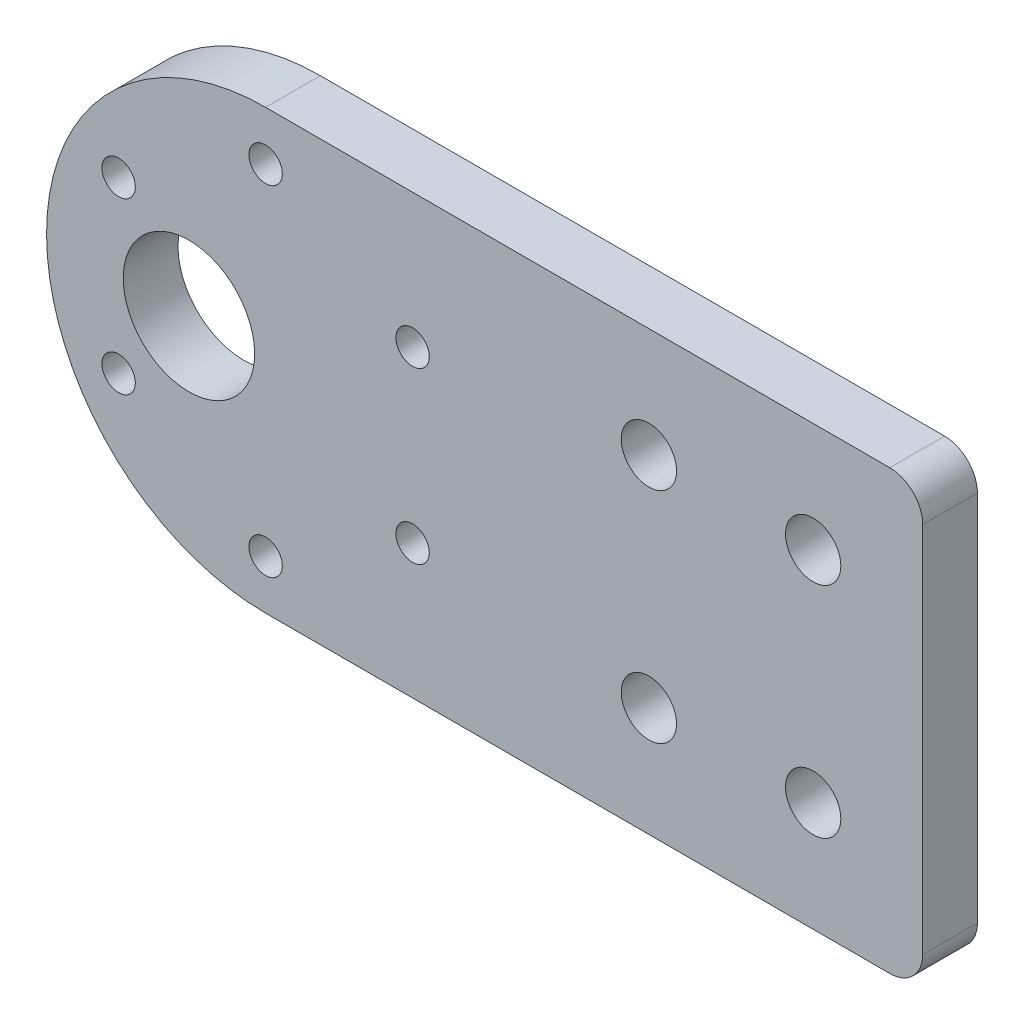
ISO-10303-21;
HEADER;
FILE_DESCRIPTION(('STEP AP214'),'2;1');
FILE_NAME('part.step','',(''),(''),'','','');
FILE_SCHEMA(('AUTOMOTIVE_DESIGN { 1 0 10303 214 1 1 1 1 }'));
ENDSEC;
DATA;
#1=APPLICATION_CONTEXT('core data for automotive mechanical design processes');
#2=APPLICATION_PROTOCOL_DEFINITION('international standard','automotive_design',2000,#1);
#3=PRODUCT_CONTEXT('',#1,'mechanical');
#4=PRODUCT('Part','Part','',(#3));
#5=PRODUCT_RELATED_PRODUCT_CATEGORY('part','',(#4));
#6=PRODUCT_DEFINITION_FORMATION('','',#4);
#7=PRODUCT_DEFINITION_CONTEXT('part definition',#1,'design');
#8=PRODUCT_DEFINITION('design','',#6,#7);
#9=PRODUCT_DEFINITION_SHAPE('','',#8);
#10=(LENGTH_UNIT() NAMED_UNIT(*) SI_UNIT(.MILLI.,.METRE.));
#11=(NAMED_UNIT(*) PLANE_ANGLE_UNIT() SI_UNIT($,.RADIAN.));
#12=(NAMED_UNIT(*) SI_UNIT($,.STERADIAN.) SOLID_ANGLE_UNIT());
#13=UNCERTAINTY_MEASURE_WITH_UNIT(LENGTH_MEASURE(1.E-05),#10,'distance_accuracy_value','');
#14=(GEOMETRIC_REPRESENTATION_CONTEXT(3) GLOBAL_UNCERTAINTY_ASSIGNED_CONTEXT((#13)) GLOBAL_UNIT_ASSIGNED_CONTEXT((#10,
#11,#12)) REPRESENTATION_CONTEXT('',''));
#15=CARTESIAN_POINT('',(0.,0.,0.));
#16=DIRECTION('',(0.,0.,1.));
#17=DIRECTION('',(1.,0.,0.));
#18=AXIS2_PLACEMENT_3D('',#15,#16,#17);
#19=CARTESIAN_POINT('',(0.,0.,5.));
#20=DIRECTION('',(0.,0.,-1.));
#21=DIRECTION('',(-1.,0.,0.));
#22=AXIS2_PLACEMENT_3D('',#19,#20,#21);
#23=PLANE('',#22);
#24=CARTESIAN_POINT('',(20.,35.5,5.));
#25=DIRECTION('',(0.,0.,1.));
#26=DIRECTION('',(1.,0.,0.));
#27=AXIS2_PLACEMENT_3D('',#24,#25,#26);
#28=CIRCLE('',#27,1.525);
#29=CARTESIAN_POINT('',(21.525,35.5,5.));
#30=VERTEX_POINT('',#29);
#31=EDGE_CURVE('E323',#30,#30,#28,.T.);
#32=ORIENTED_EDGE('',*,*,#31,.F.);
#33=EDGE_LOOP('',(#32));
#34=FACE_BOUND('',#33,.T.);
#35=CARTESIAN_POINT('',(6.57660624134164,27.7499999999996,5.));
#36=DIRECTION('',(0.,0.,1.));
#37=DIRECTION('',(1.,0.,0.));
#38=AXIS2_PLACEMENT_3D('',#35,#36,#37);
#39=CIRCLE('',#38,1.525);
#40=CARTESIAN_POINT('',(8.10160624134164,27.7499999999996,5.));
#41=VERTEX_POINT('',#40);
#42=EDGE_CURVE('E339',#41,#41,#39,.T.);
#43=ORIENTED_EDGE('',*,*,#42,.F.);
#44=EDGE_LOOP('',(#43));
#45=FACE_BOUND('',#44,.T.);
#46=CARTESIAN_POINT('',(6.57660624134222,12.2499999999994,5.));
#47=DIRECTION('',(0.,0.,1.));
#48=DIRECTION('',(1.,0.,0.));
#49=AXIS2_PLACEMENT_3D('',#46,#47,#48);
#50=CIRCLE('',#49,1.525);
#51=CARTESIAN_POINT('',(8.10160624134222,12.2499999999994,5.));
#52=VERTEX_POINT('',#51);
#53=EDGE_CURVE('E332',#52,#52,#50,.T.);
#54=ORIENTED_EDGE('',*,*,#53,.F.);
#55=EDGE_LOOP('',(#54));
#56=FACE_BOUND('',#55,.T.);
#57=CARTESIAN_POINT('',(20.0000000000013,4.5,5.));
#58=DIRECTION('',(0.,0.,1.));
#59=DIRECTION('',(1.,0.,0.));
#60=AXIS2_PLACEMENT_3D('',#57,#58,#59);
#61=CIRCLE('',#60,1.525);
#62=CARTESIAN_POINT('',(21.5250000000013,4.5,5.));
#63=VERTEX_POINT('',#62);
#64=EDGE_CURVE('E362',#63,#63,#61,.T.);
#65=ORIENTED_EDGE('',*,*,#64,.F.);
#66=EDGE_LOOP('',(#65));
#67=FACE_BOUND('',#66,.T.);
#68=CARTESIAN_POINT('',(33.4233937586598,12.2500000000006,5.));
#69=DIRECTION('',(0.,0.,1.));
#70=DIRECTION('',(1.,0.,0.));
#71=AXIS2_PLACEMENT_3D('',#68,#69,#70);
#72=CIRCLE('',#71,1.525);
#73=CARTESIAN_POINT('',(34.9483937586598,12.2500000000006,5.));
#74=VERTEX_POINT('',#73);
#75=EDGE_CURVE('E356',#74,#74,#72,.T.);
#76=ORIENTED_EDGE('',*,*,#75,.F.);
#77=EDGE_LOOP('',(#76));
#78=FACE_BOUND('',#77,.T.);
#79=CARTESIAN_POINT('',(33.4233937586592,27.7500000000006,5.));
#80=DIRECTION('',(0.,0.,1.));
#81=DIRECTION('',(1.,0.,0.));
#82=AXIS2_PLACEMENT_3D('',#79,#80,#81);
#83=CIRCLE('',#82,1.525);
#84=CARTESIAN_POINT('',(34.9483937586592,27.7500000000006,5.));
#85=VERTEX_POINT('',#84);
#86=EDGE_CURVE('E350',#85,#85,#83,.T.);
#87=ORIENTED_EDGE('',*,*,#86,.F.);
#88=EDGE_LOOP('',(#87));
#89=FACE_BOUND('',#88,.T.);
#90=CARTESIAN_POINT('',(13.,20.,5.));
#91=DIRECTION('',(0.,0.,1.));
#92=DIRECTION('',(1.,0.,0.));
#93=AXIS2_PLACEMENT_3D('',#90,#91,#92);
#94=CIRCLE('',#93,6.);
#95=CARTESIAN_POINT('',(19.,20.,5.));
#96=VERTEX_POINT('',#95);
#97=EDGE_CURVE('E329',#96,#96,#94,.T.);
#98=ORIENTED_EDGE('',*,*,#97,.F.);
#99=EDGE_LOOP('',(#98));
#100=FACE_BOUND('',#99,.T.);
#101=CARTESIAN_POINT('',(70.,30.,5.));
#102=DIRECTION('',(0.,0.,1.));
#103=DIRECTION('',(1.,0.,0.));
#104=AXIS2_PLACEMENT_3D('',#101,#102,#103);
#105=CIRCLE('',#104,2.52499999999999);
#106=CARTESIAN_POINT('',(72.525,30.,5.));
#107=VERTEX_POINT('',#106);
#108=EDGE_CURVE('E370',#107,#107,#105,.T.);
#109=ORIENTED_EDGE('',*,*,#108,.F.);
#110=EDGE_LOOP('',(#109));
#111=FACE_BOUND('',#110,.T.);
#112=CARTESIAN_POINT('',(55.,10.,5.));
#113=DIRECTION('',(0.,0.,1.));
#114=DIRECTION('',(1.,0.,0.));
#115=AXIS2_PLACEMENT_3D('',#112,#113,#114);
#116=CIRCLE('',#115,2.525);
#117=CARTESIAN_POINT('',(57.525,10.,5.));
#118=VERTEX_POINT('',#117);
#119=EDGE_CURVE('E376',#118,#118,#116,.T.);
#120=ORIENTED_EDGE('',*,*,#119,.F.);
#121=EDGE_LOOP('',(#120));
#122=FACE_BOUND('',#121,.T.);
#123=CARTESIAN_POINT('',(70.,10.,5.));
#124=DIRECTION('',(0.,0.,1.));
#125=DIRECTION('',(1.,0.,0.));
#126=AXIS2_PLACEMENT_3D('',#123,#124,#125);
#127=CIRCLE('',#126,2.52499999999999);
#128=CARTESIAN_POINT('',(72.525,10.,5.));
#129=VERTEX_POINT('',#128);
#130=EDGE_CURVE('E327',#129,#129,#127,.T.);
#131=ORIENTED_EDGE('',*,*,#130,.F.);
#132=EDGE_LOOP('',(#131));
#133=FACE_BOUND('',#132,.T.);
#134=CARTESIAN_POINT('',(55.,30.,5.));
#135=DIRECTION('',(0.,0.,1.));
#136=DIRECTION('',(1.,0.,0.));
#137=AXIS2_PLACEMENT_3D('',#134,#135,#136);
#138=CIRCLE('',#137,2.525);
#139=CARTESIAN_POINT('',(57.525,30.,5.));
#140=VERTEX_POINT('',#139);
#141=EDGE_CURVE('E128',#140,#140,#138,.T.);
#142=ORIENTED_EDGE('',*,*,#141,.F.);
#143=EDGE_LOOP('',(#142));
#144=FACE_BOUND('',#143,.T.);
#145=DIRECTION('',(1.,0.,0.));
#146=VECTOR('',#145,1.);
#147=CARTESIAN_POINT('',(80.,0.,5.));
#148=LINE('',#147,#146);
#149=CARTESIAN_POINT('',(20.,0.,5.));
#150=VERTEX_POINT('',#149);
#151=CARTESIAN_POINT('',(77.,0.,5.));
#152=VERTEX_POINT('',#151);
#153=EDGE_CURVE('E113',#150,#152,#148,.T.);
#154=ORIENTED_EDGE('',*,*,#153,.T.);
#155=CARTESIAN_POINT('',(77.,3.,5.));
#156=DIRECTION('',(0.,0.,-1.));
#157=DIRECTION('',(-1.,0.,0.));
#158=AXIS2_PLACEMENT_3D('',#155,#156,#157);
#159=CIRCLE('',#158,3.);
#160=CARTESIAN_POINT('',(80.,3.,5.));
#161=VERTEX_POINT('',#160);
#162=EDGE_CURVE('E58',#152,#161,#159,.F.);
#163=ORIENTED_EDGE('',*,*,#162,.T.);
#164=DIRECTION('',(0.,1.,0.));
#165=VECTOR('',#164,1.);
#166=CARTESIAN_POINT('',(80.,40.,5.));
#167=LINE('',#166,#165);
#168=CARTESIAN_POINT('',(80.,37.,5.));
#169=VERTEX_POINT('',#168);
#170=EDGE_CURVE('E139',#161,#169,#167,.T.);
#171=ORIENTED_EDGE('',*,*,#170,.T.);
#172=CARTESIAN_POINT('',(77.,37.,5.));
#173=DIRECTION('',(0.,0.,-1.));
#174=DIRECTION('',(-1.,0.,0.));
#175=AXIS2_PLACEMENT_3D('',#172,#173,#174);
#176=CIRCLE('',#175,3.);
#177=CARTESIAN_POINT('',(77.,40.,5.));
#178=VERTEX_POINT('',#177);
#179=EDGE_CURVE('E65',#169,#178,#176,.F.);
#180=ORIENTED_EDGE('',*,*,#179,.T.);
#181=DIRECTION('',(-1.,0.,0.));
#182=VECTOR('',#181,1.);
#183=CARTESIAN_POINT('',(0.,40.,5.));
#184=LINE('',#183,#182);
#185=CARTESIAN_POINT('',(20.,40.,5.));
#186=VERTEX_POINT('',#185);
#187=EDGE_CURVE('E141',#178,#186,#184,.T.);
#188=ORIENTED_EDGE('',*,*,#187,.T.);
#189=CARTESIAN_POINT('',(20.,20.,5.));
#190=DIRECTION('',(0.,0.,1.));
#191=DIRECTION('',(1.,0.,0.));
#192=AXIS2_PLACEMENT_3D('',#189,#190,#191);
#193=CIRCLE('',#192,20.);
#194=EDGE_CURVE('E123',#186,#150,#193,.T.);
#195=ORIENTED_EDGE('',*,*,#194,.T.);
#196=EDGE_LOOP('',(#154,#163,#171,#180,#188,#195));
#197=FACE_BOUND('',#196,.T.);
#198=ADVANCED_FACE('F50',(#34,#45,#56,#67,#78,#89,#100,#111,#122,#133,#144,#197),#23,.F.);
#199=CARTESIAN_POINT('',(0.,0.,0.));
#200=DIRECTION('',(0.,0.,-1.));
#201=DIRECTION('',(-1.,0.,0.));
#202=AXIS2_PLACEMENT_3D('',#199,#200,#201);
#203=PLANE('',#202);
#204=CARTESIAN_POINT('',(20.,35.5,0.));
#205=DIRECTION('',(0.,0.,-1.));
#206=DIRECTION('',(-1.,0.,0.));
#207=AXIS2_PLACEMENT_3D('',#204,#205,#206);
#208=CIRCLE('',#207,1.525);
#209=CARTESIAN_POINT('',(18.475,35.5,0.));
#210=VERTEX_POINT('',#209);
#211=EDGE_CURVE('E321',#210,#210,#208,.F.);
#212=ORIENTED_EDGE('',*,*,#211,.T.);
#213=EDGE_LOOP('',(#212));
#214=FACE_BOUND('',#213,.T.);
#215=CARTESIAN_POINT('',(6.57660624134164,27.7499999999996,0.));
#216=DIRECTION('',(0.,0.,-1.));
#217=DIRECTION('',(-1.,0.,0.));
#218=AXIS2_PLACEMENT_3D('',#215,#216,#217);
#219=CIRCLE('',#218,1.525);
#220=CARTESIAN_POINT('',(5.05160624134164,27.7499999999996,0.));
#221=VERTEX_POINT('',#220);
#222=EDGE_CURVE('E342',#221,#221,#219,.F.);
#223=ORIENTED_EDGE('',*,*,#222,.T.);
#224=EDGE_LOOP('',(#223));
#225=FACE_BOUND('',#224,.T.);
#226=CARTESIAN_POINT('',(6.57660624134222,12.2499999999994,0.));
#227=DIRECTION('',(0.,0.,-1.));
#228=DIRECTION('',(-1.,0.,0.));
#229=AXIS2_PLACEMENT_3D('',#226,#227,#228);
#230=CIRCLE('',#229,1.525);
#231=CARTESIAN_POINT('',(5.05160624134222,12.2499999999994,0.));
#232=VERTEX_POINT('',#231);
#233=EDGE_CURVE('E336',#232,#232,#230,.F.);
#234=ORIENTED_EDGE('',*,*,#233,.T.);
#235=EDGE_LOOP('',(#234));
#236=FACE_BOUND('',#235,.T.);
#237=CARTESIAN_POINT('',(20.0000000000013,4.5,0.));
#238=DIRECTION('',(0.,0.,-1.));
#239=DIRECTION('',(-1.,0.,0.));
#240=AXIS2_PLACEMENT_3D('',#237,#238,#239);
#241=CIRCLE('',#240,1.525);
#242=CARTESIAN_POINT('',(18.4750000000013,4.5,0.));
#243=VERTEX_POINT('',#242);
#244=EDGE_CURVE('E335',#243,#243,#241,.F.);
#245=ORIENTED_EDGE('',*,*,#244,.T.);
#246=EDGE_LOOP('',(#245));
#247=FACE_BOUND('',#246,.T.);
#248=CARTESIAN_POINT('',(33.4233937586598,12.2500000000006,0.));
#249=DIRECTION('',(0.,0.,-1.));
#250=DIRECTION('',(-1.,0.,0.));
#251=AXIS2_PLACEMENT_3D('',#248,#249,#250);
#252=CIRCLE('',#251,1.525);
#253=CARTESIAN_POINT('',(31.8983937586598,12.2500000000006,0.));
#254=VERTEX_POINT('',#253);
#255=EDGE_CURVE('E359',#254,#254,#252,.F.);
#256=ORIENTED_EDGE('',*,*,#255,.T.);
#257=EDGE_LOOP('',(#256));
#258=FACE_BOUND('',#257,.T.);
#259=CARTESIAN_POINT('',(33.4233937586592,27.7500000000006,0.));
#260=DIRECTION('',(0.,0.,-1.));
#261=DIRECTION('',(-1.,0.,0.));
#262=AXIS2_PLACEMENT_3D('',#259,#260,#261);
#263=CIRCLE('',#262,1.525);
#264=CARTESIAN_POINT('',(31.8983937586592,27.7500000000006,0.));
#265=VERTEX_POINT('',#264);
#266=EDGE_CURVE('E353',#265,#265,#263,.F.);
#267=ORIENTED_EDGE('',*,*,#266,.T.);
#268=EDGE_LOOP('',(#267));
#269=FACE_BOUND('',#268,.T.);
#270=CARTESIAN_POINT('',(13.,20.,0.));
#271=DIRECTION('',(0.,0.,-1.));
#272=DIRECTION('',(-1.,0.,0.));
#273=AXIS2_PLACEMENT_3D('',#270,#271,#272);
#274=CIRCLE('',#273,6.);
#275=CARTESIAN_POINT('',(7.00000000000002,20.,0.));
#276=VERTEX_POINT('',#275);
#277=EDGE_CURVE('E347',#276,#276,#274,.F.);
#278=ORIENTED_EDGE('',*,*,#277,.T.);
#279=EDGE_LOOP('',(#278));
#280=FACE_BOUND('',#279,.T.);
#281=CARTESIAN_POINT('',(70.,30.,0.));
#282=DIRECTION('',(0.,0.,-1.));
#283=DIRECTION('',(-1.,0.,0.));
#284=AXIS2_PLACEMENT_3D('',#281,#282,#283);
#285=CIRCLE('',#284,2.52499999999999);
#286=CARTESIAN_POINT('',(67.475,30.,0.));
#287=VERTEX_POINT('',#286);
#288=EDGE_CURVE('E373',#287,#287,#285,.F.);
#289=ORIENTED_EDGE('',*,*,#288,.T.);
#290=EDGE_LOOP('',(#289));
#291=FACE_BOUND('',#290,.T.);
#292=CARTESIAN_POINT('',(55.,10.,0.));
#293=DIRECTION('',(0.,0.,-1.));
#294=DIRECTION('',(-1.,0.,0.));
#295=AXIS2_PLACEMENT_3D('',#292,#293,#294);
#296=CIRCLE('',#295,2.525);
#297=CARTESIAN_POINT('',(52.475,10.,0.));
#298=VERTEX_POINT('',#297);
#299=EDGE_CURVE('E368',#298,#298,#296,.F.);
#300=ORIENTED_EDGE('',*,*,#299,.T.);
#301=EDGE_LOOP('',(#300));
#302=FACE_BOUND('',#301,.T.);
#303=CARTESIAN_POINT('',(70.,10.,0.));
#304=DIRECTION('',(0.,0.,-1.));
#305=DIRECTION('',(-1.,0.,0.));
#306=AXIS2_PLACEMENT_3D('',#303,#304,#305);
#307=CIRCLE('',#306,2.52499999999999);
#308=CARTESIAN_POINT('',(67.475,10.,0.));
#309=VERTEX_POINT('',#308);
#310=EDGE_CURVE('E324',#309,#309,#307,.F.);
#311=ORIENTED_EDGE('',*,*,#310,.T.);
#312=EDGE_LOOP('',(#311));
#313=FACE_BOUND('',#312,.T.);
#314=CARTESIAN_POINT('',(55.,30.,0.));
#315=DIRECTION('',(0.,0.,-1.));
#316=DIRECTION('',(-1.,0.,0.));
#317=AXIS2_PLACEMENT_3D('',#314,#315,#316);
#318=CIRCLE('',#317,2.525);
#319=CARTESIAN_POINT('',(52.475,30.,0.));
#320=VERTEX_POINT('',#319);
#321=EDGE_CURVE('E131',#320,#320,#318,.F.);
#322=ORIENTED_EDGE('',*,*,#321,.T.);
#323=EDGE_LOOP('',(#322));
#324=FACE_BOUND('',#323,.T.);
#325=DIRECTION('',(0.,1.,0.));
#326=VECTOR('',#325,1.);
#327=CARTESIAN_POINT('',(80.,40.,0.));
#328=LINE('',#327,#326);
#329=CARTESIAN_POINT('',(80.,3.,0.));
#330=VERTEX_POINT('',#329);
#331=CARTESIAN_POINT('',(80.,37.,0.));
#332=VERTEX_POINT('',#331);
#333=EDGE_CURVE('E114',#330,#332,#328,.T.);
#334=ORIENTED_EDGE('',*,*,#333,.F.);
#335=CARTESIAN_POINT('',(77.,3.,0.));
#336=DIRECTION('',(0.,0.,-1.));
#337=DIRECTION('',(-1.,0.,0.));
#338=AXIS2_PLACEMENT_3D('',#335,#336,#337);
#339=CIRCLE('',#338,3.);
#340=CARTESIAN_POINT('',(77.,0.,0.));
#341=VERTEX_POINT('',#340);
#342=EDGE_CURVE('E153',#330,#341,#339,.T.);
#343=ORIENTED_EDGE('',*,*,#342,.T.);
#344=DIRECTION('',(1.,0.,0.));
#345=VECTOR('',#344,1.);
#346=CARTESIAN_POINT('',(80.,0.,0.));
#347=LINE('',#346,#345);
#348=CARTESIAN_POINT('',(20.,0.,0.));
#349=VERTEX_POINT('',#348);
#350=EDGE_CURVE('E120',#349,#341,#347,.T.);
#351=ORIENTED_EDGE('',*,*,#350,.F.);
#352=CARTESIAN_POINT('',(20.,20.,0.));
#353=DIRECTION('',(0.,0.,-1.));
#354=DIRECTION('',(-1.,0.,0.));
#355=AXIS2_PLACEMENT_3D('',#352,#353,#354);
#356=CIRCLE('',#355,20.);
#357=CARTESIAN_POINT('',(20.,40.,0.));
#358=VERTEX_POINT('',#357);
#359=EDGE_CURVE('E117',#358,#349,#356,.F.);
#360=ORIENTED_EDGE('',*,*,#359,.F.);
#361=DIRECTION('',(-1.,0.,0.));
#362=VECTOR('',#361,1.);
#363=CARTESIAN_POINT('',(0.,40.,0.));
#364=LINE('',#363,#362);
#365=CARTESIAN_POINT('',(77.,40.,0.));
#366=VERTEX_POINT('',#365);
#367=EDGE_CURVE('E106',#366,#358,#364,.T.);
#368=ORIENTED_EDGE('',*,*,#367,.F.);
#369=CARTESIAN_POINT('',(77.,37.,0.));
#370=DIRECTION('',(0.,0.,-1.));
#371=DIRECTION('',(-1.,0.,0.));
#372=AXIS2_PLACEMENT_3D('',#369,#370,#371);
#373=CIRCLE('',#372,3.);
#374=EDGE_CURVE('E151',#366,#332,#373,.T.);
#375=ORIENTED_EDGE('',*,*,#374,.T.);
#376=EDGE_LOOP('',(#334,#343,#351,#360,#368,#375));
#377=FACE_BOUND('',#376,.T.);
#378=ADVANCED_FACE('F119',(#214,#225,#236,#247,#258,#269,#280,#291,#302,#313,#324,#377),#203,.T.);
#379=CARTESIAN_POINT('',(80.,0.,5.));
#380=DIRECTION('',(0.,1.,0.));
#381=DIRECTION('',(0.,0.,1.));
#382=AXIS2_PLACEMENT_3D('',#379,#380,#381);
#383=PLANE('',#382);
#384=ORIENTED_EDGE('',*,*,#350,.T.);
#385=DIRECTION('',(0.,0.,-1.));
#386=VECTOR('',#385,1.);
#387=CARTESIAN_POINT('',(77.,0.,5.));
#388=LINE('',#387,#386);
#389=EDGE_CURVE('E73',#341,#152,#388,.F.);
#390=ORIENTED_EDGE('',*,*,#389,.T.);
#391=ORIENTED_EDGE('',*,*,#153,.F.);
#392=DIRECTION('',(0.,0.,1.));
#393=VECTOR('',#392,1.);
#394=CARTESIAN_POINT('',(20.,0.,-0.000999999999973245));
#395=LINE('',#394,#393);
#396=EDGE_CURVE('E136',#349,#150,#395,.T.);
#397=ORIENTED_EDGE('',*,*,#396,.F.);
#398=EDGE_LOOP('',(#384,#390,#391,#397));
#399=FACE_BOUND('',#398,.T.);
#400=ADVANCED_FACE('F164',(#399),#383,.F.);
#401=CARTESIAN_POINT('',(80.,40.,5.));
#402=DIRECTION('',(-1.,0.,0.));
#403=DIRECTION('',(0.,0.,1.));
#404=AXIS2_PLACEMENT_3D('',#401,#402,#403);
#405=PLANE('',#404);
#406=ORIENTED_EDGE('',*,*,#170,.F.);
#407=DIRECTION('',(0.,0.,-1.));
#408=VECTOR('',#407,1.);
#409=CARTESIAN_POINT('',(80.,3.,5.));
#410=LINE('',#409,#408);
#411=EDGE_CURVE('E148',#161,#330,#410,.T.);
#412=ORIENTED_EDGE('',*,*,#411,.T.);
#413=ORIENTED_EDGE('',*,*,#333,.T.);
#414=DIRECTION('',(0.,0.,-1.));
#415=VECTOR('',#414,1.);
#416=CARTESIAN_POINT('',(80.,37.,5.));
#417=LINE('',#416,#415);
#418=EDGE_CURVE('E143',#332,#169,#417,.F.);
#419=ORIENTED_EDGE('',*,*,#418,.T.);
#420=EDGE_LOOP('',(#406,#412,#413,#419));
#421=FACE_BOUND('',#420,.T.);
#422=ADVANCED_FACE('F161',(#421),#405,.F.);
#423=CARTESIAN_POINT('',(0.,40.,5.));
#424=DIRECTION('',(0.,-1.,0.));
#425=DIRECTION('',(0.,0.,-1.));
#426=AXIS2_PLACEMENT_3D('',#423,#424,#425);
#427=PLANE('',#426);
#428=ORIENTED_EDGE('',*,*,#187,.F.);
#429=DIRECTION('',(0.,0.,-1.));
#430=VECTOR('',#429,1.);
#431=CARTESIAN_POINT('',(77.,40.,5.));
#432=LINE('',#431,#430);
#433=EDGE_CURVE('E12',#178,#366,#432,.T.);
#434=ORIENTED_EDGE('',*,*,#433,.T.);
#435=ORIENTED_EDGE('',*,*,#367,.T.);
#436=DIRECTION('',(0.,0.,1.));
#437=VECTOR('',#436,1.);
#438=CARTESIAN_POINT('',(20.,40.,-0.000999999999973245));
#439=LINE('',#438,#437);
#440=EDGE_CURVE('E110',#358,#186,#439,.T.);
#441=ORIENTED_EDGE('',*,*,#440,.T.);
#442=EDGE_LOOP('',(#428,#434,#435,#441));
#443=FACE_BOUND('',#442,.T.);
#444=ADVANCED_FACE('F108',(#443),#427,.F.);
#445=CARTESIAN_POINT('',(20.,20.,-0.000999999999973245));
#446=DIRECTION('',(0.,0.,1.));
#447=DIRECTION('',(1.,0.,0.));
#448=AXIS2_PLACEMENT_3D('',#445,#446,#447);
#449=CYLINDRICAL_SURFACE('',#448,20.);
#450=ORIENTED_EDGE('',*,*,#359,.T.);
#451=ORIENTED_EDGE('',*,*,#396,.T.);
#452=ORIENTED_EDGE('',*,*,#194,.F.);
#453=ORIENTED_EDGE('',*,*,#440,.F.);
#454=EDGE_LOOP('',(#450,#451,#452,#453));
#455=FACE_BOUND('',#454,.T.);
#456=ADVANCED_FACE('F126',(#455),#449,.T.);
#457=CARTESIAN_POINT('',(55.,30.,-0.000999999999973245));
#458=DIRECTION('',(0.,0.,1.));
#459=DIRECTION('',(1.,0.,0.));
#460=AXIS2_PLACEMENT_3D('',#457,#458,#459);
#461=CYLINDRICAL_SURFACE('',#460,2.525);
#462=ORIENTED_EDGE('',*,*,#321,.F.);
#463=EDGE_LOOP('',(#462));
#464=FACE_BOUND('',#463,.T.);
#465=ORIENTED_EDGE('',*,*,#141,.T.);
#466=EDGE_LOOP('',(#465));
#467=FACE_BOUND('',#466,.T.);
#468=ADVANCED_FACE('F212',(#464,#467),#461,.F.);
#469=CARTESIAN_POINT('',(70.,10.,-0.000999999999973245));
#470=DIRECTION('',(0.,0.,1.));
#471=DIRECTION('',(1.,0.,0.));
#472=AXIS2_PLACEMENT_3D('',#469,#470,#471);
#473=CYLINDRICAL_SURFACE('',#472,2.52499999999999);
#474=ORIENTED_EDGE('',*,*,#310,.F.);
#475=EDGE_LOOP('',(#474));
#476=FACE_BOUND('',#475,.T.);
#477=ORIENTED_EDGE('',*,*,#130,.T.);
#478=EDGE_LOOP('',(#477));
#479=FACE_BOUND('',#478,.T.);
#480=ADVANCED_FACE('F218',(#476,#479),#473,.F.);
#481=CARTESIAN_POINT('',(55.,10.,-0.000999999999973245));
#482=DIRECTION('',(0.,0.,1.));
#483=DIRECTION('',(1.,0.,0.));
#484=AXIS2_PLACEMENT_3D('',#481,#482,#483);
#485=CYLINDRICAL_SURFACE('',#484,2.525);
#486=ORIENTED_EDGE('',*,*,#299,.F.);
#487=EDGE_LOOP('',(#486));
#488=FACE_BOUND('',#487,.T.);
#489=ORIENTED_EDGE('',*,*,#119,.T.);
#490=EDGE_LOOP('',(#489));
#491=FACE_BOUND('',#490,.T.);
#492=ADVANCED_FACE('F225',(#488,#491),#485,.F.);
#493=CARTESIAN_POINT('',(70.,30.,-0.000999999999973245));
#494=DIRECTION('',(0.,0.,1.));
#495=DIRECTION('',(1.,0.,0.));
#496=AXIS2_PLACEMENT_3D('',#493,#494,#495);
#497=CYLINDRICAL_SURFACE('',#496,2.52499999999999);
#498=ORIENTED_EDGE('',*,*,#288,.F.);
#499=EDGE_LOOP('',(#498));
#500=FACE_BOUND('',#499,.T.);
#501=ORIENTED_EDGE('',*,*,#108,.T.);
#502=EDGE_LOOP('',(#501));
#503=FACE_BOUND('',#502,.T.);
#504=ADVANCED_FACE('F175',(#500,#503),#497,.F.);
#505=CARTESIAN_POINT('',(77.,3.,5.));
#506=DIRECTION('',(0.,0.,-1.));
#507=DIRECTION('',(-1.,0.,0.));
#508=AXIS2_PLACEMENT_3D('',#505,#506,#507);
#509=CYLINDRICAL_SURFACE('',#508,3.);
#510=ORIENTED_EDGE('',*,*,#162,.F.);
#511=ORIENTED_EDGE('',*,*,#389,.F.);
#512=ORIENTED_EDGE('',*,*,#342,.F.);
#513=ORIENTED_EDGE('',*,*,#411,.F.);
#514=EDGE_LOOP('',(#510,#511,#512,#513));
#515=FACE_BOUND('',#514,.T.);
#516=ADVANCED_FACE('F163',(#515),#509,.T.);
#517=CARTESIAN_POINT('',(77.,37.,5.));
#518=DIRECTION('',(0.,0.,-1.));
#519=DIRECTION('',(-1.,0.,0.));
#520=AXIS2_PLACEMENT_3D('',#517,#518,#519);
#521=CYLINDRICAL_SURFACE('',#520,3.);
#522=ORIENTED_EDGE('',*,*,#179,.F.);
#523=ORIENTED_EDGE('',*,*,#418,.F.);
#524=ORIENTED_EDGE('',*,*,#374,.F.);
#525=ORIENTED_EDGE('',*,*,#433,.F.);
#526=EDGE_LOOP('',(#522,#523,#524,#525));
#527=FACE_BOUND('',#526,.T.);
#528=ADVANCED_FACE('F52',(#527),#521,.T.);
#529=CARTESIAN_POINT('',(13.,20.,-0.000999999999973245));
#530=DIRECTION('',(0.,0.,1.));
#531=DIRECTION('',(1.,0.,0.));
#532=AXIS2_PLACEMENT_3D('',#529,#530,#531);
#533=CYLINDRICAL_SURFACE('',#532,6.);
#534=ORIENTED_EDGE('',*,*,#277,.F.);
#535=EDGE_LOOP('',(#534));
#536=FACE_BOUND('',#535,.T.);
#537=ORIENTED_EDGE('',*,*,#97,.T.);
#538=EDGE_LOOP('',(#537));
#539=FACE_BOUND('',#538,.T.);
#540=ADVANCED_FACE('F167',(#536,#539),#533,.F.);
#541=CARTESIAN_POINT('',(33.4233937586592,27.7500000000006,-0.000999999999973245));
#542=DIRECTION('',(0.,0.,1.));
#543=DIRECTION('',(1.,0.,0.));
#544=AXIS2_PLACEMENT_3D('',#541,#542,#543);
#545=CYLINDRICAL_SURFACE('',#544,1.525);
#546=ORIENTED_EDGE('',*,*,#266,.F.);
#547=EDGE_LOOP('',(#546));
#548=FACE_BOUND('',#547,.T.);
#549=ORIENTED_EDGE('',*,*,#86,.T.);
#550=EDGE_LOOP('',(#549));
#551=FACE_BOUND('',#550,.T.);
#552=ADVANCED_FACE('F172',(#548,#551),#545,.F.);
#553=CARTESIAN_POINT('',(33.4233937586598,12.2500000000006,-0.000999999999973245));
#554=DIRECTION('',(0.,0.,1.));
#555=DIRECTION('',(1.,0.,0.));
#556=AXIS2_PLACEMENT_3D('',#553,#554,#555);
#557=CYLINDRICAL_SURFACE('',#556,1.525);
#558=ORIENTED_EDGE('',*,*,#255,.F.);
#559=EDGE_LOOP('',(#558));
#560=FACE_BOUND('',#559,.T.);
#561=ORIENTED_EDGE('',*,*,#75,.T.);
#562=EDGE_LOOP('',(#561));
#563=FACE_BOUND('',#562,.T.);
#564=ADVANCED_FACE('F264',(#560,#563),#557,.F.);
#565=CARTESIAN_POINT('',(20.0000000000013,4.5,-0.000999999999973245));
#566=DIRECTION('',(0.,0.,1.));
#567=DIRECTION('',(1.,0.,0.));
#568=AXIS2_PLACEMENT_3D('',#565,#566,#567);
#569=CYLINDRICAL_SURFACE('',#568,1.525);
#570=ORIENTED_EDGE('',*,*,#244,.F.);
#571=EDGE_LOOP('',(#570));
#572=FACE_BOUND('',#571,.T.);
#573=ORIENTED_EDGE('',*,*,#64,.T.);
#574=EDGE_LOOP('',(#573));
#575=FACE_BOUND('',#574,.T.);
#576=ADVANCED_FACE('F274',(#572,#575),#569,.F.);
#577=CARTESIAN_POINT('',(6.57660624134222,12.2499999999994,-0.000999999999973245));
#578=DIRECTION('',(0.,0.,1.));
#579=DIRECTION('',(1.,0.,0.));
#580=AXIS2_PLACEMENT_3D('',#577,#578,#579);
#581=CYLINDRICAL_SURFACE('',#580,1.525);
#582=ORIENTED_EDGE('',*,*,#233,.F.);
#583=EDGE_LOOP('',(#582));
#584=FACE_BOUND('',#583,.T.);
#585=ORIENTED_EDGE('',*,*,#53,.T.);
#586=EDGE_LOOP('',(#585));
#587=FACE_BOUND('',#586,.T.);
#588=ADVANCED_FACE('F284',(#584,#587),#581,.F.);
#589=CARTESIAN_POINT('',(6.57660624134164,27.7499999999996,-0.000999999999973245));
#590=DIRECTION('',(0.,0.,1.));
#591=DIRECTION('',(1.,0.,0.));
#592=AXIS2_PLACEMENT_3D('',#589,#590,#591);
#593=CYLINDRICAL_SURFACE('',#592,1.525);
#594=ORIENTED_EDGE('',*,*,#222,.F.);
#595=EDGE_LOOP('',(#594));
#596=FACE_BOUND('',#595,.T.);
#597=ORIENTED_EDGE('',*,*,#42,.T.);
#598=EDGE_LOOP('',(#597));
#599=FACE_BOUND('',#598,.T.);
#600=ADVANCED_FACE('F294',(#596,#599),#593,.F.);
#601=CARTESIAN_POINT('',(20.,35.5,-0.000999999999973245));
#602=DIRECTION('',(0.,0.,1.));
#603=DIRECTION('',(1.,0.,0.));
#604=AXIS2_PLACEMENT_3D('',#601,#602,#603);
#605=CYLINDRICAL_SURFACE('',#604,1.525);
#606=ORIENTED_EDGE('',*,*,#211,.F.);
#607=EDGE_LOOP('',(#606));
#608=FACE_BOUND('',#607,.T.);
#609=ORIENTED_EDGE('',*,*,#31,.T.);
#610=EDGE_LOOP('',(#609));
#611=FACE_BOUND('',#610,.T.);
#612=ADVANCED_FACE('F304',(#608,#611),#605,.F.);
#613=CLOSED_SHELL('',(#198,#378,#400,#422,#444,#456,#468,#480,#492,#504,#516,#528,#540,#552,
#564,#576,#588,#600,#612));
#614=MANIFOLD_SOLID_BREP('B2',#613);
#615=ADVANCED_BREP_SHAPE_REPRESENTATION('',(#18,#614),#14);
#616=SHAPE_DEFINITION_REPRESENTATION(#9,#615);
ENDSEC;
END-ISO-10303-21;
